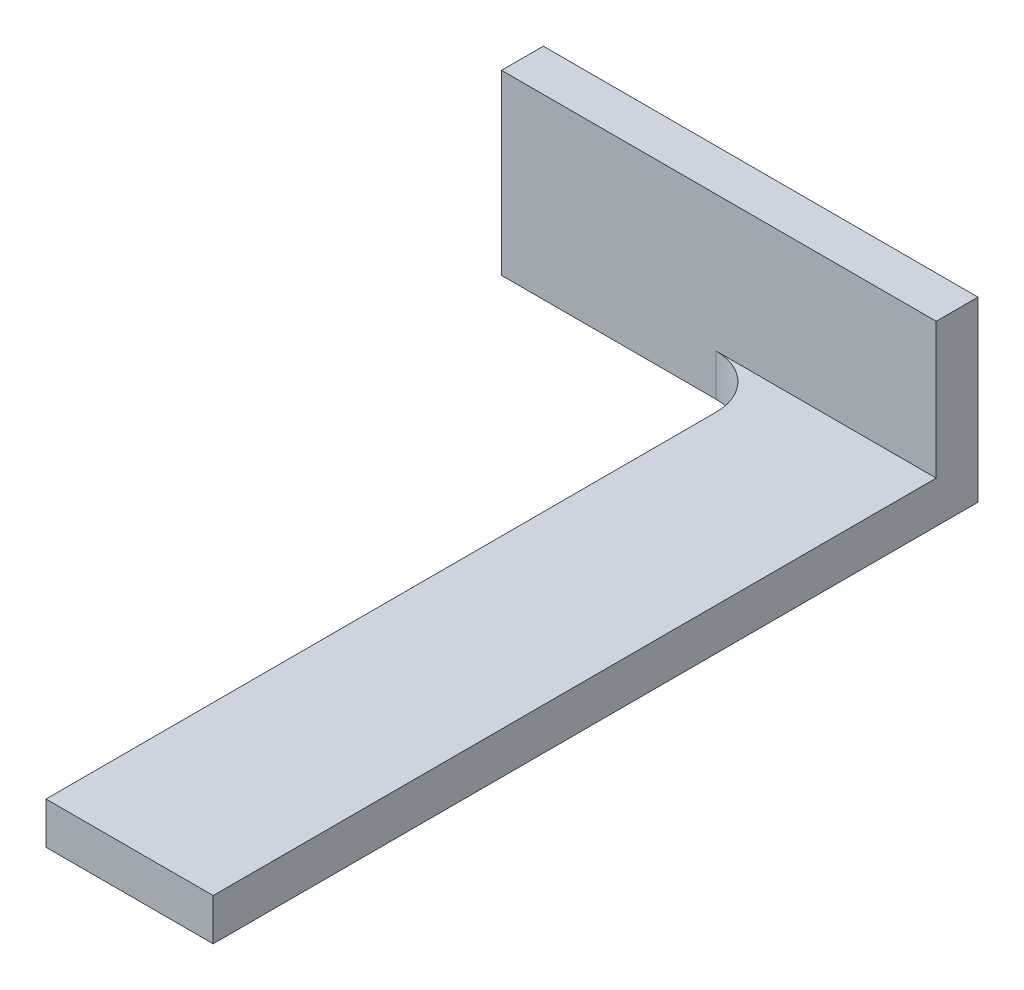
ISO-10303-21;
HEADER;
FILE_DESCRIPTION(('STEP AP214'),'2;1');
FILE_NAME('part.step','',(''),(''),'','','');
FILE_SCHEMA(('AUTOMOTIVE_DESIGN { 1 0 10303 214 1 1 1 1 }'));
ENDSEC;
DATA;
#1=APPLICATION_CONTEXT('core data for automotive mechanical design processes');
#2=APPLICATION_PROTOCOL_DEFINITION('international standard','automotive_design',2000,#1);
#3=PRODUCT_CONTEXT('',#1,'mechanical');
#4=PRODUCT('Part','Part','',(#3));
#5=PRODUCT_RELATED_PRODUCT_CATEGORY('part','',(#4));
#6=PRODUCT_DEFINITION_FORMATION('','',#4);
#7=PRODUCT_DEFINITION_CONTEXT('part definition',#1,'design');
#8=PRODUCT_DEFINITION('design','',#6,#7);
#9=PRODUCT_DEFINITION_SHAPE('','',#8);
#10=(LENGTH_UNIT() NAMED_UNIT(*) SI_UNIT(.MILLI.,.METRE.));
#11=(NAMED_UNIT(*) PLANE_ANGLE_UNIT() SI_UNIT($,.RADIAN.));
#12=(NAMED_UNIT(*) SI_UNIT($,.STERADIAN.) SOLID_ANGLE_UNIT());
#13=UNCERTAINTY_MEASURE_WITH_UNIT(LENGTH_MEASURE(1.E-05),#10,'distance_accuracy_value','');
#14=(GEOMETRIC_REPRESENTATION_CONTEXT(3) GLOBAL_UNCERTAINTY_ASSIGNED_CONTEXT((#13)) GLOBAL_UNIT_ASSIGNED_CONTEXT((#10,
#11,#12)) REPRESENTATION_CONTEXT('',''));
#15=CARTESIAN_POINT('',(0.,0.,0.));
#16=DIRECTION('',(0.,0.,1.));
#17=DIRECTION('',(1.,0.,0.));
#18=AXIS2_PLACEMENT_3D('',#15,#16,#17);
#19=CARTESIAN_POINT('',(0.,0.,5.));
#20=DIRECTION('',(1.,0.,0.));
#21=DIRECTION('',(0.,1.,0.));
#22=AXIS2_PLACEMENT_3D('',#19,#20,#21);
#23=PLANE('',#22);
#24=DIRECTION('',(0.,-1.,0.));
#25=VECTOR('',#24,1.);
#26=CARTESIAN_POINT('',(0.,0.,0.));
#27=LINE('',#26,#25);
#28=CARTESIAN_POINT('',(0.,0.,0.));
#29=VERTEX_POINT('',#28);
#30=CARTESIAN_POINT('',(0.,-21.25,0.));
#31=VERTEX_POINT('',#30);
#32=EDGE_CURVE('E117',#29,#31,#27,.T.);
#33=ORIENTED_EDGE('',*,*,#32,.T.);
#34=DIRECTION('',(0.,0.,-1.));
#35=VECTOR('',#34,1.);
#36=CARTESIAN_POINT('',(0.,-21.25,5.));
#37=LINE('',#36,#35);
#38=CARTESIAN_POINT('',(0.,-21.25,5.));
#39=VERTEX_POINT('',#38);
#40=EDGE_CURVE('E132',#39,#31,#37,.T.);
#41=ORIENTED_EDGE('',*,*,#40,.F.);
#42=DIRECTION('',(0.,-1.,0.));
#43=VECTOR('',#42,1.);
#44=CARTESIAN_POINT('',(0.,0.,5.));
#45=LINE('',#44,#43);
#46=CARTESIAN_POINT('',(0.,0.,5.));
#47=VERTEX_POINT('',#46);
#48=EDGE_CURVE('E146',#47,#39,#45,.T.);
#49=ORIENTED_EDGE('',*,*,#48,.F.);
#50=DIRECTION('',(0.,0.,-1.));
#51=VECTOR('',#50,1.);
#52=CARTESIAN_POINT('',(0.,0.,5.));
#53=LINE('',#52,#51);
#54=EDGE_CURVE('E163',#47,#29,#53,.T.);
#55=ORIENTED_EDGE('',*,*,#54,.T.);
#56=EDGE_LOOP('',(#33,#41,#49,#55));
#57=FACE_BOUND('',#56,.T.);
#58=ADVANCED_FACE('F32',(#57),#23,.F.);
#59=CARTESIAN_POINT('',(0.,-21.25,5.));
#60=DIRECTION('',(0.,1.,0.));
#61=DIRECTION('',(0.,0.,1.));
#62=AXIS2_PLACEMENT_3D('',#59,#60,#61);
#63=PLANE('',#62);
#64=DIRECTION('',(1.,0.,0.));
#65=VECTOR('',#64,1.);
#66=CARTESIAN_POINT('',(0.,-21.25,0.));
#67=LINE('',#66,#65);
#68=CARTESIAN_POINT('',(52.,-21.25,0.));
#69=VERTEX_POINT('',#68);
#70=EDGE_CURVE('E121',#31,#69,#67,.T.);
#71=ORIENTED_EDGE('',*,*,#70,.T.);
#72=DIRECTION('',(0.,0.,-1.));
#73=VECTOR('',#72,1.);
#74=CARTESIAN_POINT('',(52.,-21.25,5.));
#75=LINE('',#74,#73);
#76=CARTESIAN_POINT('',(52.,-21.25,91.5));
#77=VERTEX_POINT('',#76);
#78=EDGE_CURVE('E99',#77,#69,#75,.T.);
#79=ORIENTED_EDGE('',*,*,#78,.F.);
#80=DIRECTION('',(1.,0.,0.));
#81=VECTOR('',#80,1.);
#82=CARTESIAN_POINT('',(32.,-21.25,91.5));
#83=LINE('',#82,#81);
#84=CARTESIAN_POINT('',(32.,-21.25,91.5));
#85=VERTEX_POINT('',#84);
#86=EDGE_CURVE('E93',#85,#77,#83,.T.);
#87=ORIENTED_EDGE('',*,*,#86,.F.);
#88=DIRECTION('',(0.,0.,-1.));
#89=VECTOR('',#88,1.);
#90=CARTESIAN_POINT('',(32.,-21.25,91.5));
#91=LINE('',#90,#89);
#92=CARTESIAN_POINT('',(32.,-21.25,11.35));
#93=VERTEX_POINT('',#92);
#94=EDGE_CURVE('E97',#85,#93,#91,.T.);
#95=ORIENTED_EDGE('',*,*,#94,.T.);
#96=CARTESIAN_POINT('',(25.65,-21.25,11.35));
#97=DIRECTION('',(0.,1.,0.));
#98=DIRECTION('',(0.,0.,1.));
#99=AXIS2_PLACEMENT_3D('',#96,#97,#98);
#100=CIRCLE('',#99,6.35);
#101=CARTESIAN_POINT('',(25.65,-21.25,5.));
#102=VERTEX_POINT('',#101);
#103=EDGE_CURVE('E40',#93,#102,#100,.T.);
#104=ORIENTED_EDGE('',*,*,#103,.T.);
#105=DIRECTION('',(1.,0.,0.));
#106=VECTOR('',#105,1.);
#107=CARTESIAN_POINT('',(0.,-21.25,5.));
#108=LINE('',#107,#106);
#109=EDGE_CURVE('E139',#39,#102,#108,.T.);
#110=ORIENTED_EDGE('',*,*,#109,.F.);
#111=ORIENTED_EDGE('',*,*,#40,.T.);
#112=EDGE_LOOP('',(#71,#79,#87,#95,#104,#110,#111));
#113=FACE_BOUND('',#112,.T.);
#114=ADVANCED_FACE('F95',(#113),#63,.F.);
#115=CARTESIAN_POINT('',(52.,0.,5.));
#116=DIRECTION('',(-1.,0.,0.));
#117=DIRECTION('',(0.,0.,1.));
#118=AXIS2_PLACEMENT_3D('',#115,#116,#117);
#119=PLANE('',#118);
#120=DIRECTION('',(0.,1.,0.));
#121=VECTOR('',#120,1.);
#122=CARTESIAN_POINT('',(52.,0.,0.));
#123=LINE('',#122,#121);
#124=CARTESIAN_POINT('',(52.,0.,0.));
#125=VERTEX_POINT('',#124);
#126=EDGE_CURVE('E171',#69,#125,#123,.T.);
#127=ORIENTED_EDGE('',*,*,#126,.T.);
#128=DIRECTION('',(0.,0.,-1.));
#129=VECTOR('',#128,1.);
#130=CARTESIAN_POINT('',(52.,0.,5.));
#131=LINE('',#130,#129);
#132=CARTESIAN_POINT('',(52.,0.,5.));
#133=VERTEX_POINT('',#132);
#134=EDGE_CURVE('E167',#133,#125,#131,.T.);
#135=ORIENTED_EDGE('',*,*,#134,.F.);
#136=DIRECTION('',(0.,1.,0.));
#137=VECTOR('',#136,1.);
#138=CARTESIAN_POINT('',(52.,0.,5.));
#139=LINE('',#138,#137);
#140=CARTESIAN_POINT('',(52.,-16.25,5.));
#141=VERTEX_POINT('',#140);
#142=EDGE_CURVE('E156',#141,#133,#139,.T.);
#143=ORIENTED_EDGE('',*,*,#142,.F.);
#144=DIRECTION('',(0.,0.,-1.));
#145=VECTOR('',#144,1.);
#146=CARTESIAN_POINT('',(52.,-16.25,91.5));
#147=LINE('',#146,#145);
#148=CARTESIAN_POINT('',(52.,-16.25,91.5));
#149=VERTEX_POINT('',#148);
#150=EDGE_CURVE('E118',#149,#141,#147,.T.);
#151=ORIENTED_EDGE('',*,*,#150,.F.);
#152=DIRECTION('',(0.,1.,0.));
#153=VECTOR('',#152,1.);
#154=CARTESIAN_POINT('',(52.,-21.25,91.5));
#155=LINE('',#154,#153);
#156=EDGE_CURVE('E102',#77,#149,#155,.T.);
#157=ORIENTED_EDGE('',*,*,#156,.F.);
#158=ORIENTED_EDGE('',*,*,#78,.T.);
#159=EDGE_LOOP('',(#127,#135,#143,#151,#157,#158));
#160=FACE_BOUND('',#159,.T.);
#161=ADVANCED_FACE('F185',(#160),#119,.F.);
#162=CARTESIAN_POINT('',(0.,0.,5.));
#163=DIRECTION('',(0.,-1.,0.));
#164=DIRECTION('',(0.,0.,-1.));
#165=AXIS2_PLACEMENT_3D('',#162,#163,#164);
#166=PLANE('',#165);
#167=DIRECTION('',(-1.,0.,0.));
#168=VECTOR('',#167,1.);
#169=CARTESIAN_POINT('',(0.,0.,0.));
#170=LINE('',#169,#168);
#171=EDGE_CURVE('E148',#125,#29,#170,.T.);
#172=ORIENTED_EDGE('',*,*,#171,.T.);
#173=ORIENTED_EDGE('',*,*,#54,.F.);
#174=DIRECTION('',(-1.,0.,0.));
#175=VECTOR('',#174,1.);
#176=CARTESIAN_POINT('',(0.,0.,5.));
#177=LINE('',#176,#175);
#178=EDGE_CURVE('E159',#133,#47,#177,.T.);
#179=ORIENTED_EDGE('',*,*,#178,.F.);
#180=ORIENTED_EDGE('',*,*,#134,.T.);
#181=EDGE_LOOP('',(#172,#173,#179,#180));
#182=FACE_BOUND('',#181,.T.);
#183=ADVANCED_FACE('F187',(#182),#166,.F.);
#184=CARTESIAN_POINT('',(0.,-21.25,5.));
#185=DIRECTION('',(0.,0.,1.));
#186=DIRECTION('',(1.,0.,0.));
#187=AXIS2_PLACEMENT_3D('',#184,#185,#186);
#188=PLANE('',#187);
#189=ORIENTED_EDGE('',*,*,#109,.T.);
#190=DIRECTION('',(0.,-1.,0.));
#191=VECTOR('',#190,1.);
#192=CARTESIAN_POINT('',(25.65,-21.25,5.));
#193=LINE('',#192,#191);
#194=CARTESIAN_POINT('',(25.65,-16.25,5.));
#195=VERTEX_POINT('',#194);
#196=EDGE_CURVE('E131',#102,#195,#193,.F.);
#197=ORIENTED_EDGE('',*,*,#196,.T.);
#198=DIRECTION('',(-1.,0.,0.));
#199=VECTOR('',#198,1.);
#200=CARTESIAN_POINT('',(32.,-16.25,5.));
#201=LINE('',#200,#199);
#202=EDGE_CURVE('E46',#141,#195,#201,.T.);
#203=ORIENTED_EDGE('',*,*,#202,.F.);
#204=ORIENTED_EDGE('',*,*,#142,.T.);
#205=ORIENTED_EDGE('',*,*,#178,.T.);
#206=ORIENTED_EDGE('',*,*,#48,.T.);
#207=EDGE_LOOP('',(#189,#197,#203,#204,#205,#206));
#208=FACE_BOUND('',#207,.T.);
#209=ADVANCED_FACE('F136',(#208),#188,.T.);
#210=CARTESIAN_POINT('',(0.,-21.25,0.));
#211=DIRECTION('',(0.,0.,1.));
#212=DIRECTION('',(1.,0.,0.));
#213=AXIS2_PLACEMENT_3D('',#210,#211,#212);
#214=PLANE('',#213);
#215=ORIENTED_EDGE('',*,*,#32,.F.);
#216=ORIENTED_EDGE('',*,*,#171,.F.);
#217=ORIENTED_EDGE('',*,*,#126,.F.);
#218=ORIENTED_EDGE('',*,*,#70,.F.);
#219=EDGE_LOOP('',(#215,#216,#217,#218));
#220=FACE_BOUND('',#219,.T.);
#221=ADVANCED_FACE('F184',(#220),#214,.F.);
#222=CARTESIAN_POINT('',(32.,-21.25,91.5));
#223=DIRECTION('',(1.,0.,0.));
#224=DIRECTION('',(0.,0.,-1.));
#225=AXIS2_PLACEMENT_3D('',#222,#223,#224);
#226=PLANE('',#225);
#227=DIRECTION('',(0.,0.,-1.));
#228=VECTOR('',#227,1.);
#229=CARTESIAN_POINT('',(32.,-16.25,91.5));
#230=LINE('',#229,#228);
#231=CARTESIAN_POINT('',(32.,-16.25,91.5));
#232=VERTEX_POINT('',#231);
#233=CARTESIAN_POINT('',(32.,-16.25,11.35));
#234=VERTEX_POINT('',#233);
#235=EDGE_CURVE('E123',#232,#234,#230,.T.);
#236=ORIENTED_EDGE('',*,*,#235,.T.);
#237=DIRECTION('',(0.,-1.,0.));
#238=VECTOR('',#237,1.);
#239=CARTESIAN_POINT('',(32.,-21.25,11.35));
#240=LINE('',#239,#238);
#241=EDGE_CURVE('E116',#234,#93,#240,.T.);
#242=ORIENTED_EDGE('',*,*,#241,.T.);
#243=ORIENTED_EDGE('',*,*,#94,.F.);
#244=DIRECTION('',(0.,-1.,0.));
#245=VECTOR('',#244,1.);
#246=CARTESIAN_POINT('',(32.,-21.25,91.5));
#247=LINE('',#246,#245);
#248=EDGE_CURVE('E103',#232,#85,#247,.T.);
#249=ORIENTED_EDGE('',*,*,#248,.F.);
#250=EDGE_LOOP('',(#236,#242,#243,#249));
#251=FACE_BOUND('',#250,.T.);
#252=ADVANCED_FACE('F114',(#251),#226,.F.);
#253=CARTESIAN_POINT('',(32.,-16.25,91.5));
#254=DIRECTION('',(0.,-1.,0.));
#255=DIRECTION('',(0.,0.,-1.));
#256=AXIS2_PLACEMENT_3D('',#253,#254,#255);
#257=PLANE('',#256);
#258=ORIENTED_EDGE('',*,*,#202,.T.);
#259=CARTESIAN_POINT('',(25.65,-16.25,11.35));
#260=DIRECTION('',(0.,-1.,0.));
#261=DIRECTION('',(0.,0.,-1.));
#262=AXIS2_PLACEMENT_3D('',#259,#260,#261);
#263=CIRCLE('',#262,6.35);
#264=EDGE_CURVE('E11',#195,#234,#263,.T.);
#265=ORIENTED_EDGE('',*,*,#264,.T.);
#266=ORIENTED_EDGE('',*,*,#235,.F.);
#267=DIRECTION('',(-1.,0.,0.));
#268=VECTOR('',#267,1.);
#269=CARTESIAN_POINT('',(32.,-16.25,91.5));
#270=LINE('',#269,#268);
#271=EDGE_CURVE('E108',#149,#232,#270,.T.);
#272=ORIENTED_EDGE('',*,*,#271,.F.);
#273=ORIENTED_EDGE('',*,*,#150,.T.);
#274=EDGE_LOOP('',(#258,#265,#266,#272,#273));
#275=FACE_BOUND('',#274,.T.);
#276=ADVANCED_FACE('F141',(#275),#257,.F.);
#277=CARTESIAN_POINT('',(32.,-16.25,91.5));
#278=DIRECTION('',(0.,0.,-1.));
#279=DIRECTION('',(-1.,0.,0.));
#280=AXIS2_PLACEMENT_3D('',#277,#278,#279);
#281=PLANE('',#280);
#282=ORIENTED_EDGE('',*,*,#248,.T.);
#283=ORIENTED_EDGE('',*,*,#86,.T.);
#284=ORIENTED_EDGE('',*,*,#156,.T.);
#285=ORIENTED_EDGE('',*,*,#271,.T.);
#286=EDGE_LOOP('',(#282,#283,#284,#285));
#287=FACE_BOUND('',#286,.T.);
#288=ADVANCED_FACE('F106',(#287),#281,.F.);
#289=CARTESIAN_POINT('',(25.65,-21.25,11.35));
#290=DIRECTION('',(0.,-1.,0.));
#291=DIRECTION('',(0.,0.,-1.));
#292=AXIS2_PLACEMENT_3D('',#289,#290,#291);
#293=CYLINDRICAL_SURFACE('',#292,6.35);
#294=ORIENTED_EDGE('',*,*,#264,.F.);
#295=ORIENTED_EDGE('',*,*,#196,.F.);
#296=ORIENTED_EDGE('',*,*,#103,.F.);
#297=ORIENTED_EDGE('',*,*,#241,.F.);
#298=EDGE_LOOP('',(#294,#295,#296,#297));
#299=FACE_BOUND('',#298,.T.);
#300=ADVANCED_FACE('F34',(#299),#293,.F.);
#301=CLOSED_SHELL('',(#58,#114,#161,#183,#209,#221,#252,#276,#288,#300));
#302=MANIFOLD_SOLID_BREP('B2',#301);
#303=ADVANCED_BREP_SHAPE_REPRESENTATION('',(#18,#302),#14);
#304=SHAPE_DEFINITION_REPRESENTATION(#9,#303);
ENDSEC;
END-ISO-10303-21;
